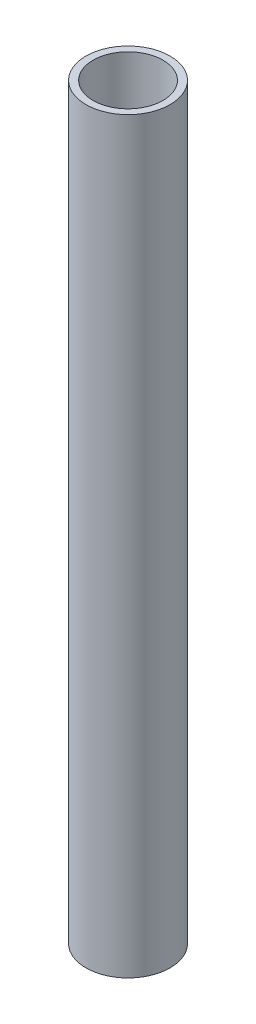
ISO-10303-21;
HEADER;
FILE_DESCRIPTION(('STEP AP214'),'2;1');
FILE_NAME('part.step','',(''),(''),'','','');
FILE_SCHEMA(('AUTOMOTIVE_DESIGN { 1 0 10303 214 1 1 1 1 }'));
ENDSEC;
DATA;
#1=APPLICATION_CONTEXT('core data for automotive mechanical design processes');
#2=APPLICATION_PROTOCOL_DEFINITION('international standard','automotive_design',2000,#1);
#3=PRODUCT_CONTEXT('',#1,'mechanical');
#4=PRODUCT('Part','Part','',(#3));
#5=PRODUCT_RELATED_PRODUCT_CATEGORY('part','',(#4));
#6=PRODUCT_DEFINITION_FORMATION('','',#4);
#7=PRODUCT_DEFINITION_CONTEXT('part definition',#1,'design');
#8=PRODUCT_DEFINITION('design','',#6,#7);
#9=PRODUCT_DEFINITION_SHAPE('','',#8);
#10=(LENGTH_UNIT() NAMED_UNIT(*) SI_UNIT(.MILLI.,.METRE.));
#11=(NAMED_UNIT(*) PLANE_ANGLE_UNIT() SI_UNIT($,.RADIAN.));
#12=(NAMED_UNIT(*) SI_UNIT($,.STERADIAN.) SOLID_ANGLE_UNIT());
#13=UNCERTAINTY_MEASURE_WITH_UNIT(LENGTH_MEASURE(1.E-05),#10,'distance_accuracy_value','');
#14=(GEOMETRIC_REPRESENTATION_CONTEXT(3) GLOBAL_UNCERTAINTY_ASSIGNED_CONTEXT((#13)) GLOBAL_UNIT_ASSIGNED_CONTEXT((#10,
#11,#12)) REPRESENTATION_CONTEXT('',''));
#15=CARTESIAN_POINT('',(0.,0.,0.));
#16=DIRECTION('',(0.,0.,1.));
#17=DIRECTION('',(1.,0.,0.));
#18=AXIS2_PLACEMENT_3D('',#15,#16,#17);
#19=CARTESIAN_POINT('',(0.,374.65,0.));
#20=DIRECTION('',(0.,1.,0.));
#21=DIRECTION('',(0.,0.,1.));
#22=AXIS2_PLACEMENT_3D('',#19,#20,#21);
#23=PLANE('',#22);
#24=CARTESIAN_POINT('',(0.,374.65,0.));
#25=DIRECTION('',(0.,1.,0.));
#26=DIRECTION('',(0.,0.,1.));
#27=AXIS2_PLACEMENT_3D('',#24,#25,#26);
#28=CIRCLE('',#27,21.082);
#29=CARTESIAN_POINT('',(0.,374.65,-21.082));
#30=VERTEX_POINT('',#29);
#31=EDGE_CURVE('E12',#30,#30,#28,.T.);
#32=ORIENTED_EDGE('',*,*,#31,.T.);
#33=EDGE_LOOP('',(#32));
#34=FACE_BOUND('',#33,.T.);
#35=CARTESIAN_POINT('',(0.,374.65,0.));
#36=DIRECTION('',(0.,1.,0.));
#37=DIRECTION('',(0.,0.,1.));
#38=AXIS2_PLACEMENT_3D('',#35,#36,#37);
#39=CIRCLE('',#38,17.526);
#40=CARTESIAN_POINT('',(0.,374.65,-17.526));
#41=VERTEX_POINT('',#40);
#42=EDGE_CURVE('E51',#41,#41,#39,.T.);
#43=ORIENTED_EDGE('',*,*,#42,.F.);
#44=EDGE_LOOP('',(#43));
#45=FACE_BOUND('',#44,.T.);
#46=ADVANCED_FACE('F40',(#34,#45),#23,.T.);
#47=CARTESIAN_POINT('',(0.,0.,0.));
#48=DIRECTION('',(0.,1.,0.));
#49=DIRECTION('',(0.,0.,1.));
#50=AXIS2_PLACEMENT_3D('',#47,#48,#49);
#51=PLANE('',#50);
#52=CARTESIAN_POINT('',(0.,0.,0.));
#53=DIRECTION('',(0.,1.,0.));
#54=DIRECTION('',(0.,0.,1.));
#55=AXIS2_PLACEMENT_3D('',#52,#53,#54);
#56=CIRCLE('',#55,21.082);
#57=CARTESIAN_POINT('',(0.,0.,-21.082));
#58=VERTEX_POINT('',#57);
#59=EDGE_CURVE('E44',#58,#58,#56,.T.);
#60=ORIENTED_EDGE('',*,*,#59,.F.);
#61=EDGE_LOOP('',(#60));
#62=FACE_BOUND('',#61,.T.);
#63=CARTESIAN_POINT('',(0.,0.,0.));
#64=DIRECTION('',(0.,1.,0.));
#65=DIRECTION('',(0.,0.,1.));
#66=AXIS2_PLACEMENT_3D('',#63,#64,#65);
#67=CIRCLE('',#66,17.526);
#68=CARTESIAN_POINT('',(0.,0.,-17.526));
#69=VERTEX_POINT('',#68);
#70=EDGE_CURVE('E53',#69,#69,#67,.T.);
#71=ORIENTED_EDGE('',*,*,#70,.T.);
#72=EDGE_LOOP('',(#71));
#73=FACE_BOUND('',#72,.T.);
#74=ADVANCED_FACE('F63',(#62,#73),#51,.F.);
#75=CARTESIAN_POINT('',(0.,374.65,0.));
#76=DIRECTION('',(0.,-1.,0.));
#77=DIRECTION('',(0.,0.,-1.));
#78=AXIS2_PLACEMENT_3D('',#75,#76,#77);
#79=CYLINDRICAL_SURFACE('',#78,21.082);
#80=CARTESIAN_POINT('',(0.,374.65,-21.082));
#81=CARTESIAN_POINT('',(0.,370.747395833333,-21.082));
#82=CARTESIAN_POINT('',(0.,366.844791666667,-21.082));
#83=CARTESIAN_POINT('',(0.,359.039583333333,-21.082));
#84=CARTESIAN_POINT('',(0.,355.136979166667,-21.082));
#85=CARTESIAN_POINT('',(0.,347.331770833333,-21.082));
#86=CARTESIAN_POINT('',(0.,343.429166666667,-21.082));
#87=CARTESIAN_POINT('',(0.,335.623958333333,-21.082));
#88=CARTESIAN_POINT('',(0.,331.721354166667,-21.082));
#89=CARTESIAN_POINT('',(0.,323.916145833333,-21.082));
#90=CARTESIAN_POINT('',(0.,320.013541666667,-21.082));
#91=CARTESIAN_POINT('',(0.,312.208333333333,-21.082));
#92=CARTESIAN_POINT('',(0.,308.305729166667,-21.082));
#93=CARTESIAN_POINT('',(0.,300.500520833333,-21.082));
#94=CARTESIAN_POINT('',(0.,296.597916666667,-21.082));
#95=CARTESIAN_POINT('',(0.,288.792708333333,-21.082));
#96=CARTESIAN_POINT('',(0.,284.890104166667,-21.082));
#97=CARTESIAN_POINT('',(0.,277.084895833333,-21.082));
#98=CARTESIAN_POINT('',(0.,273.182291666667,-21.082));
#99=CARTESIAN_POINT('',(0.,265.377083333333,-21.082));
#100=CARTESIAN_POINT('',(0.,261.474479166667,-21.082));
#101=CARTESIAN_POINT('',(0.,253.669270833333,-21.082));
#102=CARTESIAN_POINT('',(0.,249.766666666667,-21.082));
#103=CARTESIAN_POINT('',(0.,241.961458333333,-21.082));
#104=CARTESIAN_POINT('',(0.,238.058854166667,-21.082));
#105=CARTESIAN_POINT('',(0.,230.253645833333,-21.082));
#106=CARTESIAN_POINT('',(0.,226.351041666667,-21.082));
#107=CARTESIAN_POINT('',(0.,218.545833333333,-21.082));
#108=CARTESIAN_POINT('',(0.,214.643229166667,-21.082));
#109=CARTESIAN_POINT('',(0.,206.838020833333,-21.082));
#110=CARTESIAN_POINT('',(0.,202.935416666667,-21.082));
#111=CARTESIAN_POINT('',(0.,195.130208333333,-21.082));
#112=CARTESIAN_POINT('',(0.,191.227604166667,-21.082));
#113=CARTESIAN_POINT('',(0.,183.422395833333,-21.082));
#114=CARTESIAN_POINT('',(0.,179.519791666667,-21.082));
#115=CARTESIAN_POINT('',(0.,171.714583333333,-21.082));
#116=CARTESIAN_POINT('',(0.,167.811979166667,-21.082));
#117=CARTESIAN_POINT('',(0.,160.006770833333,-21.082));
#118=CARTESIAN_POINT('',(0.,156.104166666667,-21.082));
#119=CARTESIAN_POINT('',(0.,148.298958333333,-21.082));
#120=CARTESIAN_POINT('',(0.,144.396354166667,-21.082));
#121=CARTESIAN_POINT('',(0.,136.591145833333,-21.082));
#122=CARTESIAN_POINT('',(0.,132.688541666667,-21.082));
#123=CARTESIAN_POINT('',(0.,124.883333333333,-21.082));
#124=CARTESIAN_POINT('',(0.,120.980729166667,-21.082));
#125=CARTESIAN_POINT('',(0.,113.175520833333,-21.082));
#126=CARTESIAN_POINT('',(0.,109.272916666667,-21.082));
#127=CARTESIAN_POINT('',(0.,101.467708333333,-21.082));
#128=CARTESIAN_POINT('',(0.,97.5651041666667,-21.082));
#129=CARTESIAN_POINT('',(0.,89.7598958333333,-21.082));
#130=CARTESIAN_POINT('',(0.,85.8572916666667,-21.082));
#131=CARTESIAN_POINT('',(0.,78.0520833333333,-21.082));
#132=CARTESIAN_POINT('',(0.,74.1494791666667,-21.082));
#133=CARTESIAN_POINT('',(0.,66.3442708333333,-21.082));
#134=CARTESIAN_POINT('',(0.,62.4416666666667,-21.082));
#135=CARTESIAN_POINT('',(0.,54.6364583333333,-21.082));
#136=CARTESIAN_POINT('',(0.,50.7338541666667,-21.082));
#137=CARTESIAN_POINT('',(0.,42.9286458333333,-21.082));
#138=CARTESIAN_POINT('',(0.,39.0260416666667,-21.082));
#139=CARTESIAN_POINT('',(0.,31.2208333333333,-21.082));
#140=CARTESIAN_POINT('',(0.,27.3182291666667,-21.082));
#141=CARTESIAN_POINT('',(0.,19.5130208333333,-21.082));
#142=CARTESIAN_POINT('',(0.,15.6104166666667,-21.082));
#143=CARTESIAN_POINT('',(0.,7.80520833333335,-21.082));
#144=CARTESIAN_POINT('',(0.,3.90260416666668,-21.082));
#145=CARTESIAN_POINT('',(0.,0.,-21.082));
#146=B_SPLINE_CURVE_WITH_KNOTS('',3,(#80,#81,#82,#83,#84,#85,#86,#87,#88,#89,#90,#91,#92,#93,
#94,#95,#96,#97,#98,#99,#100,#101,#102,#103,#104,#105,#106,#107,#108,#109,#110,#111,#112,#113,
#114,#115,#116,#117,#118,#119,#120,#121,#122,#123,#124,#125,#126,#127,#128,#129,#130,#131,#132,
#133,#134,#135,#136,#137,#138,#139,#140,#141,#142,#143,#144,#145),.UNSPECIFIED.,.F.,.F.,(4,2,2,
2,2,2,2,2,2,2,2,2,2,2,2,2,2,2,2,2,2,2,2,2,2,2,2,2,2,2,2,2,4),(0.,11.7078125,23.4156250000001,
35.1234375,46.83125,58.5390625,70.246875,81.9546875,93.6625,105.3703125,117.078125,128.7859375,
140.49375,152.2015625,163.909375,175.6171875,187.325,199.0328125,210.740625,222.4484375,
234.15625,245.8640625,257.571875,269.2796875,280.9875,292.6953125,304.403125,316.1109375,
327.81875,339.5265625,351.234375,362.9421875,374.65),.UNSPECIFIED.);
#147=EDGE_CURVE('BSEAM42',#30,#58,#146,.T.);
#148=ORIENTED_EDGE('',*,*,#31,.F.);
#149=ORIENTED_EDGE('',*,*,#59,.T.);
#150=ORIENTED_EDGE('',*,*,#147,.T.);
#151=ORIENTED_EDGE('',*,*,#147,.F.);
#152=EDGE_LOOP('',(#148,#150,#149,#151));
#153=FACE_BOUND('',#152,.T.);
#154=ADVANCED_FACE('F42',(#153),#79,.T.);
#155=CARTESIAN_POINT('',(0.,374.65,0.));
#156=DIRECTION('',(0.,-1.,0.));
#157=DIRECTION('',(0.,0.,-1.));
#158=AXIS2_PLACEMENT_3D('',#155,#156,#157);
#159=CYLINDRICAL_SURFACE('',#158,17.526);
#160=CARTESIAN_POINT('',(0.,374.65,-17.526));
#161=CARTESIAN_POINT('',(0.,370.747395833333,-17.526));
#162=CARTESIAN_POINT('',(0.,366.844791666667,-17.526));
#163=CARTESIAN_POINT('',(0.,359.039583333333,-17.526));
#164=CARTESIAN_POINT('',(0.,355.136979166667,-17.526));
#165=CARTESIAN_POINT('',(0.,347.331770833333,-17.526));
#166=CARTESIAN_POINT('',(0.,343.429166666667,-17.526));
#167=CARTESIAN_POINT('',(0.,335.623958333333,-17.526));
#168=CARTESIAN_POINT('',(0.,331.721354166667,-17.526));
#169=CARTESIAN_POINT('',(0.,323.916145833333,-17.526));
#170=CARTESIAN_POINT('',(0.,320.013541666667,-17.526));
#171=CARTESIAN_POINT('',(0.,312.208333333333,-17.526));
#172=CARTESIAN_POINT('',(0.,308.305729166667,-17.526));
#173=CARTESIAN_POINT('',(0.,300.500520833333,-17.526));
#174=CARTESIAN_POINT('',(0.,296.597916666667,-17.526));
#175=CARTESIAN_POINT('',(0.,288.792708333333,-17.526));
#176=CARTESIAN_POINT('',(0.,284.890104166667,-17.526));
#177=CARTESIAN_POINT('',(0.,277.084895833333,-17.526));
#178=CARTESIAN_POINT('',(0.,273.182291666667,-17.526));
#179=CARTESIAN_POINT('',(0.,265.377083333333,-17.526));
#180=CARTESIAN_POINT('',(0.,261.474479166667,-17.526));
#181=CARTESIAN_POINT('',(0.,253.669270833333,-17.526));
#182=CARTESIAN_POINT('',(0.,249.766666666667,-17.526));
#183=CARTESIAN_POINT('',(0.,241.961458333333,-17.526));
#184=CARTESIAN_POINT('',(0.,238.058854166667,-17.526));
#185=CARTESIAN_POINT('',(0.,230.253645833333,-17.526));
#186=CARTESIAN_POINT('',(0.,226.351041666667,-17.526));
#187=CARTESIAN_POINT('',(0.,218.545833333333,-17.526));
#188=CARTESIAN_POINT('',(0.,214.643229166667,-17.526));
#189=CARTESIAN_POINT('',(0.,206.838020833333,-17.526));
#190=CARTESIAN_POINT('',(0.,202.935416666667,-17.526));
#191=CARTESIAN_POINT('',(0.,195.130208333333,-17.526));
#192=CARTESIAN_POINT('',(0.,191.227604166667,-17.526));
#193=CARTESIAN_POINT('',(0.,183.422395833333,-17.526));
#194=CARTESIAN_POINT('',(0.,179.519791666667,-17.526));
#195=CARTESIAN_POINT('',(0.,171.714583333333,-17.526));
#196=CARTESIAN_POINT('',(0.,167.811979166667,-17.526));
#197=CARTESIAN_POINT('',(0.,160.006770833333,-17.526));
#198=CARTESIAN_POINT('',(0.,156.104166666667,-17.526));
#199=CARTESIAN_POINT('',(0.,148.298958333333,-17.526));
#200=CARTESIAN_POINT('',(0.,144.396354166667,-17.526));
#201=CARTESIAN_POINT('',(0.,136.591145833333,-17.526));
#202=CARTESIAN_POINT('',(0.,132.688541666667,-17.526));
#203=CARTESIAN_POINT('',(0.,124.883333333333,-17.526));
#204=CARTESIAN_POINT('',(0.,120.980729166667,-17.526));
#205=CARTESIAN_POINT('',(0.,113.175520833333,-17.526));
#206=CARTESIAN_POINT('',(0.,109.272916666667,-17.526));
#207=CARTESIAN_POINT('',(0.,101.467708333333,-17.526));
#208=CARTESIAN_POINT('',(0.,97.5651041666667,-17.526));
#209=CARTESIAN_POINT('',(0.,89.7598958333333,-17.526));
#210=CARTESIAN_POINT('',(0.,85.8572916666667,-17.526));
#211=CARTESIAN_POINT('',(0.,78.0520833333333,-17.526));
#212=CARTESIAN_POINT('',(0.,74.1494791666667,-17.526));
#213=CARTESIAN_POINT('',(0.,66.3442708333333,-17.526));
#214=CARTESIAN_POINT('',(0.,62.4416666666667,-17.526));
#215=CARTESIAN_POINT('',(0.,54.6364583333333,-17.526));
#216=CARTESIAN_POINT('',(0.,50.7338541666667,-17.526));
#217=CARTESIAN_POINT('',(0.,42.9286458333333,-17.526));
#218=CARTESIAN_POINT('',(0.,39.0260416666667,-17.526));
#219=CARTESIAN_POINT('',(0.,31.2208333333333,-17.526));
#220=CARTESIAN_POINT('',(0.,27.3182291666667,-17.526));
#221=CARTESIAN_POINT('',(0.,19.5130208333333,-17.526));
#222=CARTESIAN_POINT('',(0.,15.6104166666667,-17.526));
#223=CARTESIAN_POINT('',(0.,7.80520833333335,-17.526));
#224=CARTESIAN_POINT('',(0.,3.90260416666668,-17.526));
#225=CARTESIAN_POINT('',(0.,0.,-17.526));
#226=B_SPLINE_CURVE_WITH_KNOTS('',3,(#160,#161,#162,#163,#164,#165,#166,#167,#168,#169,#170,
#171,#172,#173,#174,#175,#176,#177,#178,#179,#180,#181,#182,#183,#184,#185,#186,#187,#188,#189,
#190,#191,#192,#193,#194,#195,#196,#197,#198,#199,#200,#201,#202,#203,#204,#205,#206,#207,#208,
#209,#210,#211,#212,#213,#214,#215,#216,#217,#218,#219,#220,#221,#222,#223,#224,#225),
.UNSPECIFIED.,.F.,.F.,(4,2,2,2,2,2,2,2,2,2,2,2,2,2,2,2,2,2,2,2,2,2,2,2,2,2,2,2,2,2,2,2,4),(0.,
11.7078125,23.4156250000001,35.1234375,46.83125,58.5390625,70.246875,81.9546875,93.6625,
105.3703125,117.078125,128.7859375,140.49375,152.2015625,163.909375,175.6171875,187.325,
199.0328125,210.740625,222.4484375,234.15625,245.8640625,257.571875,269.2796875,280.9875,
292.6953125,304.403125,316.1109375,327.81875,339.5265625,351.234375,362.9421875,374.65),.UNSPECIFIED.);
#227=EDGE_CURVE('BSEAM59',#41,#69,#226,.T.);
#228=ORIENTED_EDGE('',*,*,#42,.T.);
#229=ORIENTED_EDGE('',*,*,#70,.F.);
#230=ORIENTED_EDGE('',*,*,#227,.T.);
#231=ORIENTED_EDGE('',*,*,#227,.F.);
#232=EDGE_LOOP('',(#228,#230,#229,#231));
#233=FACE_BOUND('',#232,.T.);
#234=ADVANCED_FACE('F59',(#233),#159,.F.);
#235=CLOSED_SHELL('',(#46,#74,#154,#234));
#236=MANIFOLD_SOLID_BREP('B2',#235);
#237=ADVANCED_BREP_SHAPE_REPRESENTATION('',(#18,#236),#14);
#238=SHAPE_DEFINITION_REPRESENTATION(#9,#237);
ENDSEC;
END-ISO-10303-21;
